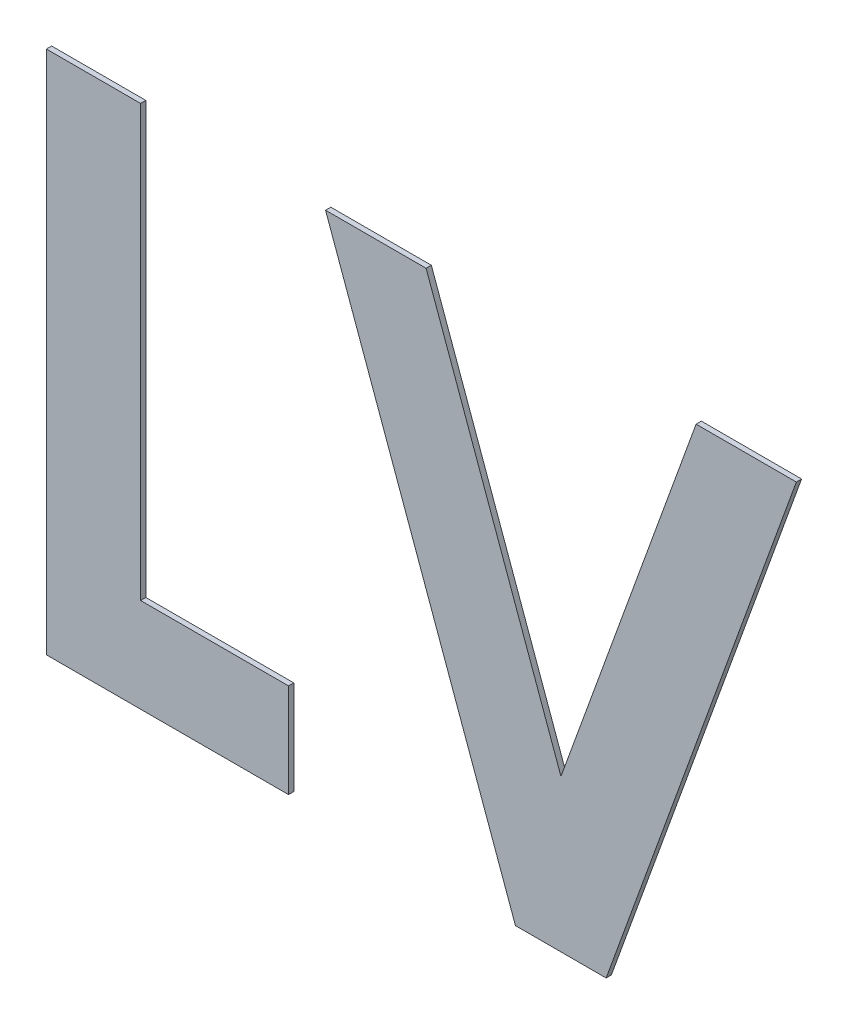
ISO-10303-21;
HEADER;
FILE_DESCRIPTION(('STEP AP214'),'2;1');
FILE_NAME('part.step','',(''),(''),'','','');
FILE_SCHEMA(('AUTOMOTIVE_DESIGN { 1 0 10303 214 1 1 1 1 }'));
ENDSEC;
DATA;
#1=APPLICATION_CONTEXT('core data for automotive mechanical design processes');
#2=APPLICATION_PROTOCOL_DEFINITION('international standard','automotive_design',2000,#1);
#3=PRODUCT_CONTEXT('',#1,'mechanical');
#4=PRODUCT('Part','Part','',(#3));
#5=PRODUCT_RELATED_PRODUCT_CATEGORY('part','',(#4));
#6=PRODUCT_DEFINITION_FORMATION('','',#4);
#7=PRODUCT_DEFINITION_CONTEXT('part definition',#1,'design');
#8=PRODUCT_DEFINITION('design','',#6,#7);
#9=PRODUCT_DEFINITION_SHAPE('','',#8);
#10=(LENGTH_UNIT() NAMED_UNIT(*) SI_UNIT(.MILLI.,.METRE.));
#11=(NAMED_UNIT(*) PLANE_ANGLE_UNIT() SI_UNIT($,.RADIAN.));
#12=(NAMED_UNIT(*) SI_UNIT($,.STERADIAN.) SOLID_ANGLE_UNIT());
#13=UNCERTAINTY_MEASURE_WITH_UNIT(LENGTH_MEASURE(1.E-05),#10,'distance_accuracy_value','');
#14=(GEOMETRIC_REPRESENTATION_CONTEXT(3) GLOBAL_UNCERTAINTY_ASSIGNED_CONTEXT((#13)) GLOBAL_UNIT_ASSIGNED_CONTEXT((#10,
#11,#12)) REPRESENTATION_CONTEXT('',''));
#15=CARTESIAN_POINT('',(0.,0.,0.));
#16=DIRECTION('',(0.,0.,1.));
#17=DIRECTION('',(1.,0.,0.));
#18=AXIS2_PLACEMENT_3D('',#15,#16,#17);
#19=CARTESIAN_POINT('',(1.8968858000619,0.686633141168239,0.1));
#20=DIRECTION('',(-0.940292875779529,-0.340366431597277,0.));
#21=DIRECTION('',(0.340366431597277,-0.940292875779529,0.));
#22=AXIS2_PLACEMENT_3D('',#19,#20,#21);
#23=PLANE('',#22);
#24=DIRECTION('',(-0.340366431597277,0.940292875779529,0.));
#25=VECTOR('',#24,1.);
#26=CARTESIAN_POINT('',(1.8968858000619,0.686633141168239,0.));
#27=LINE('',#26,#25);
#28=CARTESIAN_POINT('',(2.14543269230769,0.,0.));
#29=VERTEX_POINT('',#28);
#30=CARTESIAN_POINT('',(-1.47435897435898,10.,0.));
#31=VERTEX_POINT('',#30);
#32=EDGE_CURVE('E137',#29,#31,#27,.T.);
#33=ORIENTED_EDGE('',*,*,#32,.F.);
#34=DIRECTION('',(0.,0.,-1.));
#35=VECTOR('',#34,1.);
#36=CARTESIAN_POINT('',(2.14543269230769,0.,0.1));
#37=LINE('',#36,#35);
#38=CARTESIAN_POINT('',(2.14543269230769,0.,0.1));
#39=VERTEX_POINT('',#38);
#40=EDGE_CURVE('E12',#39,#29,#37,.T.);
#41=ORIENTED_EDGE('',*,*,#40,.F.);
#42=DIRECTION('',(-0.340366431597277,0.940292875779529,0.));
#43=VECTOR('',#42,1.);
#44=CARTESIAN_POINT('',(1.8968858000619,0.686633141168239,0.1));
#45=LINE('',#44,#43);
#46=CARTESIAN_POINT('',(-1.47435897435898,10.,0.1));
#47=VERTEX_POINT('',#46);
#48=EDGE_CURVE('E154',#39,#47,#45,.T.);
#49=ORIENTED_EDGE('',*,*,#48,.T.);
#50=DIRECTION('',(0.,0.,-1.));
#51=VECTOR('',#50,1.);
#52=CARTESIAN_POINT('',(-1.47435897435898,10.,0.1));
#53=LINE('',#52,#51);
#54=EDGE_CURVE('E65',#47,#31,#53,.T.);
#55=ORIENTED_EDGE('',*,*,#54,.T.);
#56=EDGE_LOOP('',(#33,#41,#49,#55));
#57=FACE_BOUND('',#56,.T.);
#58=ADVANCED_FACE('F49',(#57),#23,.T.);
#59=CARTESIAN_POINT('',(0.,0.,0.1));
#60=DIRECTION('',(0.,1.,0.));
#61=DIRECTION('',(0.,0.,1.));
#62=AXIS2_PLACEMENT_3D('',#59,#60,#61);
#63=PLANE('',#62);
#64=DIRECTION('',(1.,0.,0.));
#65=VECTOR('',#64,1.);
#66=CARTESIAN_POINT('',(0.,0.,0.));
#67=LINE('',#66,#65);
#68=CARTESIAN_POINT('',(3.87419871794872,0.,0.));
#69=VERTEX_POINT('',#68);
#70=EDGE_CURVE('E139',#29,#69,#67,.T.);
#71=ORIENTED_EDGE('',*,*,#70,.T.);
#72=DIRECTION('',(0.,0.,-1.));
#73=VECTOR('',#72,1.);
#74=CARTESIAN_POINT('',(3.87419871794872,0.,0.1));
#75=LINE('',#74,#73);
#76=CARTESIAN_POINT('',(3.87419871794872,0.,0.1));
#77=VERTEX_POINT('',#76);
#78=EDGE_CURVE('E57',#77,#69,#75,.T.);
#79=ORIENTED_EDGE('',*,*,#78,.F.);
#80=DIRECTION('',(1.,0.,0.));
#81=VECTOR('',#80,1.);
#82=CARTESIAN_POINT('',(0.,0.,0.1));
#83=LINE('',#82,#81);
#84=EDGE_CURVE('E173',#39,#77,#83,.T.);
#85=ORIENTED_EDGE('',*,*,#84,.F.);
#86=ORIENTED_EDGE('',*,*,#40,.T.);
#87=EDGE_LOOP('',(#71,#79,#85,#86));
#88=FACE_BOUND('',#87,.T.);
#89=ADVANCED_FACE('F167',(#88),#63,.F.);
#90=CARTESIAN_POINT('',(3.4240572582852,-1.24149511969075,0.1));
#91=DIRECTION('',(0.940111927409656,-0.340865903167363,0.));
#92=DIRECTION('',(0.340865903167363,0.940111927409656,0.));
#93=AXIS2_PLACEMENT_3D('',#90,#91,#92);
#94=PLANE('',#93);
#95=DIRECTION('',(-0.340865903167363,-0.940111927409656,0.));
#96=VECTOR('',#95,1.);
#97=CARTESIAN_POINT('',(3.4240572582852,-1.24149511969075,0.));
#98=LINE('',#97,#96);
#99=CARTESIAN_POINT('',(7.5,10.,0.));
#100=VERTEX_POINT('',#99);
#101=EDGE_CURVE('E142',#100,#69,#98,.T.);
#102=ORIENTED_EDGE('',*,*,#101,.F.);
#103=DIRECTION('',(0.,0.,-1.));
#104=VECTOR('',#103,1.);
#105=CARTESIAN_POINT('',(7.5,10.,0.1));
#106=LINE('',#105,#104);
#107=CARTESIAN_POINT('',(7.5,10.,0.1));
#108=VERTEX_POINT('',#107);
#109=EDGE_CURVE('E158',#108,#100,#106,.T.);
#110=ORIENTED_EDGE('',*,*,#109,.F.);
#111=DIRECTION('',(-0.340865903167363,-0.940111927409656,0.));
#112=VECTOR('',#111,1.);
#113=CARTESIAN_POINT('',(3.4240572582852,-1.24149511969075,0.1));
#114=LINE('',#113,#112);
#115=EDGE_CURVE('E164',#108,#77,#114,.T.);
#116=ORIENTED_EDGE('',*,*,#115,.T.);
#117=ORIENTED_EDGE('',*,*,#78,.T.);
#118=EDGE_LOOP('',(#102,#110,#116,#117));
#119=FACE_BOUND('',#118,.T.);
#120=ADVANCED_FACE('F163',(#119),#94,.T.);
#121=CARTESIAN_POINT('',(0.,10.,0.1));
#122=DIRECTION('',(0.,1.,0.));
#123=DIRECTION('',(0.,0.,1.));
#124=AXIS2_PLACEMENT_3D('',#121,#122,#123);
#125=PLANE('',#124);
#126=DIRECTION('',(1.,0.,0.));
#127=VECTOR('',#126,1.);
#128=CARTESIAN_POINT('',(0.,10.,0.));
#129=LINE('',#128,#127);
#130=CARTESIAN_POINT('',(5.58894230769231,10.,0.));
#131=VERTEX_POINT('',#130);
#132=EDGE_CURVE('E145',#131,#100,#129,.T.);
#133=ORIENTED_EDGE('',*,*,#132,.F.);
#134=DIRECTION('',(0.,0.,-1.));
#135=VECTOR('',#134,1.);
#136=CARTESIAN_POINT('',(5.58894230769231,10.,0.1));
#137=LINE('',#136,#135);
#138=CARTESIAN_POINT('',(5.58894230769231,10.,0.1));
#139=VERTEX_POINT('',#138);
#140=EDGE_CURVE('E118',#139,#131,#137,.T.);
#141=ORIENTED_EDGE('',*,*,#140,.F.);
#142=DIRECTION('',(1.,0.,0.));
#143=VECTOR('',#142,1.);
#144=CARTESIAN_POINT('',(0.,10.,0.1));
#145=LINE('',#144,#143);
#146=EDGE_CURVE('E129',#139,#108,#145,.T.);
#147=ORIENTED_EDGE('',*,*,#146,.T.);
#148=ORIENTED_EDGE('',*,*,#109,.T.);
#149=EDGE_LOOP('',(#133,#141,#147,#148));
#150=FACE_BOUND('',#149,.T.);
#151=ADVANCED_FACE('F172',(#150),#125,.T.);
#152=CARTESIAN_POINT('',(1.73422838813107,-0.628939003704614,0.1));
#153=DIRECTION('',(-0.940087214266092,0.340934054581555,0.));
#154=DIRECTION('',(-0.340934054581555,-0.940087214266092,0.));
#155=AXIS2_PLACEMENT_3D('',#152,#153,#154);
#156=PLANE('',#155);
#157=DIRECTION('',(0.340934054581555,0.940087214266092,0.));
#158=VECTOR('',#157,1.);
#159=CARTESIAN_POINT('',(1.73422838813107,-0.628939003704614,0.));
#160=LINE('',#159,#158);
#161=CARTESIAN_POINT('',(3.01282051282051,2.89663461538462,0.));
#162=VERTEX_POINT('',#161);
#163=EDGE_CURVE('E114',#162,#131,#160,.T.);
#164=ORIENTED_EDGE('',*,*,#163,.F.);
#165=DIRECTION('',(0.,0.,-1.));
#166=VECTOR('',#165,1.);
#167=CARTESIAN_POINT('',(3.01282051282051,2.89663461538462,0.1));
#168=LINE('',#167,#166);
#169=CARTESIAN_POINT('',(3.01282051282051,2.89663461538462,0.1));
#170=VERTEX_POINT('',#169);
#171=EDGE_CURVE('E109',#170,#162,#168,.T.);
#172=ORIENTED_EDGE('',*,*,#171,.F.);
#173=DIRECTION('',(0.340934054581555,0.940087214266092,0.));
#174=VECTOR('',#173,1.);
#175=CARTESIAN_POINT('',(1.73422838813107,-0.628939003704614,0.1));
#176=LINE('',#175,#174);
#177=EDGE_CURVE('E112',#170,#139,#176,.T.);
#178=ORIENTED_EDGE('',*,*,#177,.T.);
#179=ORIENTED_EDGE('',*,*,#140,.T.);
#180=EDGE_LOOP('',(#164,#172,#178,#179));
#181=FACE_BOUND('',#180,.T.);
#182=ADVANCED_FACE('F111',(#181),#156,.T.);
#183=CARTESIAN_POINT('',(3.59079534630478,1.29920767888016,0.1));
#184=DIRECTION('',(0.94034193178737,0.340230879436886,0.));
#185=DIRECTION('',(-0.340230879436886,0.94034193178737,0.));
#186=AXIS2_PLACEMENT_3D('',#183,#184,#185);
#187=PLANE('',#186);
#188=DIRECTION('',(0.340230879436886,-0.94034193178737,0.));
#189=VECTOR('',#188,1.);
#190=CARTESIAN_POINT('',(3.59079534630478,1.29920767888016,0.));
#191=LINE('',#190,#189);
#192=CARTESIAN_POINT('',(0.442708333333333,10.,0.));
#193=VERTEX_POINT('',#192);
#194=EDGE_CURVE('E149',#193,#162,#191,.T.);
#195=ORIENTED_EDGE('',*,*,#194,.F.);
#196=DIRECTION('',(0.,0.,-1.));
#197=VECTOR('',#196,1.);
#198=CARTESIAN_POINT('',(0.442708333333333,10.,0.1));
#199=LINE('',#198,#197);
#200=CARTESIAN_POINT('',(0.442708333333333,10.,0.1));
#201=VERTEX_POINT('',#200);
#202=EDGE_CURVE('E87',#201,#193,#199,.T.);
#203=ORIENTED_EDGE('',*,*,#202,.F.);
#204=DIRECTION('',(0.340230879436886,-0.94034193178737,0.));
#205=VECTOR('',#204,1.);
#206=CARTESIAN_POINT('',(3.59079534630478,1.29920767888016,0.1));
#207=LINE('',#206,#205);
#208=EDGE_CURVE('E126',#201,#170,#207,.T.);
#209=ORIENTED_EDGE('',*,*,#208,.T.);
#210=ORIENTED_EDGE('',*,*,#171,.T.);
#211=EDGE_LOOP('',(#195,#203,#209,#210));
#212=FACE_BOUND('',#211,.T.);
#213=ADVANCED_FACE('F131',(#212),#187,.T.);
#214=CARTESIAN_POINT('',(0.,10.,0.1));
#215=DIRECTION('',(0.,1.,0.));
#216=DIRECTION('',(0.,0.,1.));
#217=AXIS2_PLACEMENT_3D('',#214,#215,#216);
#218=PLANE('',#217);
#219=DIRECTION('',(1.,0.,0.));
#220=VECTOR('',#219,1.);
#221=CARTESIAN_POINT('',(0.,10.,0.));
#222=LINE('',#221,#220);
#223=EDGE_CURVE('E151',#31,#193,#222,.T.);
#224=ORIENTED_EDGE('',*,*,#223,.F.);
#225=ORIENTED_EDGE('',*,*,#54,.F.);
#226=DIRECTION('',(1.,0.,0.));
#227=VECTOR('',#226,1.);
#228=CARTESIAN_POINT('',(0.,10.,0.1));
#229=LINE('',#228,#227);
#230=EDGE_CURVE('E132',#47,#201,#229,.T.);
#231=ORIENTED_EDGE('',*,*,#230,.T.);
#232=ORIENTED_EDGE('',*,*,#202,.T.);
#233=EDGE_LOOP('',(#224,#225,#231,#232));
#234=FACE_BOUND('',#233,.T.);
#235=ADVANCED_FACE('F177',(#234),#218,.T.);
#236=CARTESIAN_POINT('',(0.,0.,0.1));
#237=DIRECTION('',(0.,0.,1.));
#238=DIRECTION('',(1.,0.,0.));
#239=AXIS2_PLACEMENT_3D('',#236,#237,#238);
#240=PLANE('',#239);
#241=ORIENTED_EDGE('',*,*,#48,.F.);
#242=ORIENTED_EDGE('',*,*,#84,.T.);
#243=ORIENTED_EDGE('',*,*,#115,.F.);
#244=ORIENTED_EDGE('',*,*,#146,.F.);
#245=ORIENTED_EDGE('',*,*,#177,.F.);
#246=ORIENTED_EDGE('',*,*,#208,.F.);
#247=ORIENTED_EDGE('',*,*,#230,.F.);
#248=EDGE_LOOP('',(#241,#242,#243,#244,#245,#246,#247));
#249=FACE_BOUND('',#248,.T.);
#250=ADVANCED_FACE('F124',(#249),#240,.T.);
#251=CARTESIAN_POINT('',(0.,0.,0.));
#252=DIRECTION('',(0.,0.,1.));
#253=DIRECTION('',(1.,0.,0.));
#254=AXIS2_PLACEMENT_3D('',#251,#252,#253);
#255=PLANE('',#254);
#256=ORIENTED_EDGE('',*,*,#32,.T.);
#257=ORIENTED_EDGE('',*,*,#223,.T.);
#258=ORIENTED_EDGE('',*,*,#194,.T.);
#259=ORIENTED_EDGE('',*,*,#163,.T.);
#260=ORIENTED_EDGE('',*,*,#132,.T.);
#261=ORIENTED_EDGE('',*,*,#101,.T.);
#262=ORIENTED_EDGE('',*,*,#70,.F.);
#263=EDGE_LOOP('',(#256,#257,#258,#259,#260,#261,#262));
#264=FACE_BOUND('',#263,.T.);
#265=ADVANCED_FACE('F169',(#264),#255,.F.);
#266=CLOSED_SHELL('',(#58,#89,#120,#151,#182,#213,#235,#250,#265));
#267=MANIFOLD_SOLID_BREP('B2',#266);
#268=CARTESIAN_POINT('',(-6.7948717948718,0.,0.1));
#269=DIRECTION('',(-1.,0.,0.));
#270=DIRECTION('',(0.,0.,1.));
#271=AXIS2_PLACEMENT_3D('',#268,#269,#270);
#272=PLANE('',#271);
#273=DIRECTION('',(0.,1.,0.));
#274=VECTOR('',#273,1.);
#275=CARTESIAN_POINT('',(-6.7948717948718,0.,0.));
#276=LINE('',#275,#274);
#277=CARTESIAN_POINT('',(-6.7948717948718,0.,0.));
#278=VERTEX_POINT('',#277);
#279=CARTESIAN_POINT('',(-6.7948717948718,10.,0.));
#280=VERTEX_POINT('',#279);
#281=EDGE_CURVE('E353',#278,#280,#276,.T.);
#282=ORIENTED_EDGE('',*,*,#281,.F.);
#283=DIRECTION('',(0.,0.,-1.));
#284=VECTOR('',#283,1.);
#285=CARTESIAN_POINT('',(-6.7948717948718,0.,0.1));
#286=LINE('',#285,#284);
#287=CARTESIAN_POINT('',(-6.7948717948718,0.,0.1));
#288=VERTEX_POINT('',#287);
#289=EDGE_CURVE('E47',#288,#278,#286,.T.);
#290=ORIENTED_EDGE('',*,*,#289,.F.);
#291=DIRECTION('',(0.,1.,0.));
#292=VECTOR('',#291,1.);
#293=CARTESIAN_POINT('',(-6.7948717948718,0.,0.1));
#294=LINE('',#293,#292);
#295=CARTESIAN_POINT('',(-6.7948717948718,10.,0.1));
#296=VERTEX_POINT('',#295);
#297=EDGE_CURVE('E367',#288,#296,#294,.T.);
#298=ORIENTED_EDGE('',*,*,#297,.T.);
#299=DIRECTION('',(0.,0.,-1.));
#300=VECTOR('',#299,1.);
#301=CARTESIAN_POINT('',(-6.7948717948718,10.,0.1));
#302=LINE('',#301,#300);
#303=EDGE_CURVE('E288',#296,#280,#302,.T.);
#304=ORIENTED_EDGE('',*,*,#303,.T.);
#305=EDGE_LOOP('',(#282,#290,#298,#304));
#306=FACE_BOUND('',#305,.T.);
#307=ADVANCED_FACE('F272',(#306),#272,.T.);
#308=CARTESIAN_POINT('',(0.,0.,0.1));
#309=DIRECTION('',(0.,1.,0.));
#310=DIRECTION('',(0.,0.,1.));
#311=AXIS2_PLACEMENT_3D('',#308,#309,#310);
#312=PLANE('',#311);
#313=DIRECTION('',(1.,0.,0.));
#314=VECTOR('',#313,1.);
#315=CARTESIAN_POINT('',(0.,0.,0.));
#316=LINE('',#315,#314);
#317=CARTESIAN_POINT('',(-2.17948717948718,0.,0.));
#318=VERTEX_POINT('',#317);
#319=EDGE_CURVE('E355',#278,#318,#316,.T.);
#320=ORIENTED_EDGE('',*,*,#319,.T.);
#321=DIRECTION('',(0.,0.,-1.));
#322=VECTOR('',#321,1.);
#323=CARTESIAN_POINT('',(-2.17948717948718,0.,0.1));
#324=LINE('',#323,#322);
#325=CARTESIAN_POINT('',(-2.17948717948718,0.,0.1));
#326=VERTEX_POINT('',#325);
#327=EDGE_CURVE('E280',#326,#318,#324,.T.);
#328=ORIENTED_EDGE('',*,*,#327,.F.);
#329=DIRECTION('',(1.,0.,0.));
#330=VECTOR('',#329,1.);
#331=CARTESIAN_POINT('',(0.,0.,0.1));
#332=LINE('',#331,#330);
#333=EDGE_CURVE('E461',#288,#326,#332,.T.);
#334=ORIENTED_EDGE('',*,*,#333,.F.);
#335=ORIENTED_EDGE('',*,*,#289,.T.);
#336=EDGE_LOOP('',(#320,#328,#334,#335));
#337=FACE_BOUND('',#336,.T.);
#338=ADVANCED_FACE('F376',(#337),#312,.F.);
#339=CARTESIAN_POINT('',(-2.17948717948718,0.,0.1));
#340=DIRECTION('',(1.,0.,0.));
#341=DIRECTION('',(0.,0.,-1.));
#342=AXIS2_PLACEMENT_3D('',#339,#340,#341);
#343=PLANE('',#342);
#344=DIRECTION('',(0.,-1.,0.));
#345=VECTOR('',#344,1.);
#346=CARTESIAN_POINT('',(-2.17948717948718,0.,0.));
#347=LINE('',#346,#345);
#348=CARTESIAN_POINT('',(-2.17948717948718,1.79487179487179,0.));
#349=VERTEX_POINT('',#348);
#350=EDGE_CURVE('E358',#349,#318,#347,.T.);
#351=ORIENTED_EDGE('',*,*,#350,.F.);
#352=DIRECTION('',(0.,0.,-1.));
#353=VECTOR('',#352,1.);
#354=CARTESIAN_POINT('',(-2.17948717948718,1.79487179487179,0.1));
#355=LINE('',#354,#353);
#356=CARTESIAN_POINT('',(-2.17948717948718,1.79487179487179,0.1));
#357=VERTEX_POINT('',#356);
#358=EDGE_CURVE('E335',#357,#349,#355,.T.);
#359=ORIENTED_EDGE('',*,*,#358,.F.);
#360=DIRECTION('',(0.,-1.,0.));
#361=VECTOR('',#360,1.);
#362=CARTESIAN_POINT('',(-2.17948717948718,0.,0.1));
#363=LINE('',#362,#361);
#364=EDGE_CURVE('E345',#357,#326,#363,.T.);
#365=ORIENTED_EDGE('',*,*,#364,.T.);
#366=ORIENTED_EDGE('',*,*,#327,.T.);
#367=EDGE_LOOP('',(#351,#359,#365,#366));
#368=FACE_BOUND('',#367,.T.);
#369=ADVANCED_FACE('F373',(#368),#343,.T.);
#370=CARTESIAN_POINT('',(0.,1.79487179487179,0.1));
#371=DIRECTION('',(0.,1.,0.));
#372=DIRECTION('',(0.,0.,1.));
#373=AXIS2_PLACEMENT_3D('',#370,#371,#372);
#374=PLANE('',#373);
#375=DIRECTION('',(1.,0.,0.));
#376=VECTOR('',#375,1.);
#377=CARTESIAN_POINT('',(0.,1.79487179487179,0.));
#378=LINE('',#377,#376);
#379=CARTESIAN_POINT('',(-5.,1.79487179487179,0.));
#380=VERTEX_POINT('',#379);
#381=EDGE_CURVE('E331',#380,#349,#378,.T.);
#382=ORIENTED_EDGE('',*,*,#381,.F.);
#383=DIRECTION('',(0.,0.,-1.));
#384=VECTOR('',#383,1.);
#385=CARTESIAN_POINT('',(-5.,1.79487179487179,0.1));
#386=LINE('',#385,#384);
#387=CARTESIAN_POINT('',(-5.,1.79487179487179,0.1));
#388=VERTEX_POINT('',#387);
#389=EDGE_CURVE('E326',#388,#380,#386,.T.);
#390=ORIENTED_EDGE('',*,*,#389,.F.);
#391=DIRECTION('',(1.,0.,0.));
#392=VECTOR('',#391,1.);
#393=CARTESIAN_POINT('',(0.,1.79487179487179,0.1));
#394=LINE('',#393,#392);
#395=EDGE_CURVE('E329',#388,#357,#394,.T.);
#396=ORIENTED_EDGE('',*,*,#395,.T.);
#397=ORIENTED_EDGE('',*,*,#358,.T.);
#398=EDGE_LOOP('',(#382,#390,#396,#397));
#399=FACE_BOUND('',#398,.T.);
#400=ADVANCED_FACE('F328',(#399),#374,.T.);
#401=CARTESIAN_POINT('',(-5.,0.,0.1));
#402=DIRECTION('',(1.,0.,0.));
#403=DIRECTION('',(0.,0.,-1.));
#404=AXIS2_PLACEMENT_3D('',#401,#402,#403);
#405=PLANE('',#404);
#406=DIRECTION('',(0.,-1.,0.));
#407=VECTOR('',#406,1.);
#408=CARTESIAN_POINT('',(-5.,0.,0.));
#409=LINE('',#408,#407);
#410=CARTESIAN_POINT('',(-5.,10.,0.));
#411=VERTEX_POINT('',#410);
#412=EDGE_CURVE('E362',#411,#380,#409,.T.);
#413=ORIENTED_EDGE('',*,*,#412,.F.);
#414=DIRECTION('',(0.,0.,-1.));
#415=VECTOR('',#414,1.);
#416=CARTESIAN_POINT('',(-5.,10.,0.1));
#417=LINE('',#416,#415);
#418=CARTESIAN_POINT('',(-5.,10.,0.1));
#419=VERTEX_POINT('',#418);
#420=EDGE_CURVE('E307',#419,#411,#417,.T.);
#421=ORIENTED_EDGE('',*,*,#420,.F.);
#422=DIRECTION('',(0.,-1.,0.));
#423=VECTOR('',#422,1.);
#424=CARTESIAN_POINT('',(-5.,0.,0.1));
#425=LINE('',#424,#423);
#426=EDGE_CURVE('E343',#419,#388,#425,.T.);
#427=ORIENTED_EDGE('',*,*,#426,.T.);
#428=ORIENTED_EDGE('',*,*,#389,.T.);
#429=EDGE_LOOP('',(#413,#421,#427,#428));
#430=FACE_BOUND('',#429,.T.);
#431=ADVANCED_FACE('F347',(#430),#405,.T.);
#432=CARTESIAN_POINT('',(0.,10.,0.1));
#433=DIRECTION('',(0.,1.,0.));
#434=DIRECTION('',(0.,0.,1.));
#435=AXIS2_PLACEMENT_3D('',#432,#433,#434);
#436=PLANE('',#435);
#437=DIRECTION('',(1.,0.,0.));
#438=VECTOR('',#437,1.);
#439=CARTESIAN_POINT('',(0.,10.,0.));
#440=LINE('',#439,#438);
#441=EDGE_CURVE('E364',#280,#411,#440,.T.);
#442=ORIENTED_EDGE('',*,*,#441,.F.);
#443=ORIENTED_EDGE('',*,*,#303,.F.);
#444=DIRECTION('',(1.,0.,0.));
#445=VECTOR('',#444,1.);
#446=CARTESIAN_POINT('',(0.,10.,0.1));
#447=LINE('',#446,#445);
#448=EDGE_CURVE('E348',#296,#419,#447,.T.);
#449=ORIENTED_EDGE('',*,*,#448,.T.);
#450=ORIENTED_EDGE('',*,*,#420,.T.);
#451=EDGE_LOOP('',(#442,#443,#449,#450));
#452=FACE_BOUND('',#451,.T.);
#453=ADVANCED_FACE('F379',(#452),#436,.T.);
#454=CARTESIAN_POINT('',(0.,0.,0.1));
#455=DIRECTION('',(0.,0.,1.));
#456=DIRECTION('',(1.,0.,0.));
#457=AXIS2_PLACEMENT_3D('',#454,#455,#456);
#458=PLANE('',#457);
#459=ORIENTED_EDGE('',*,*,#297,.F.);
#460=ORIENTED_EDGE('',*,*,#333,.T.);
#461=ORIENTED_EDGE('',*,*,#364,.F.);
#462=ORIENTED_EDGE('',*,*,#395,.F.);
#463=ORIENTED_EDGE('',*,*,#426,.F.);
#464=ORIENTED_EDGE('',*,*,#448,.F.);
#465=EDGE_LOOP('',(#459,#460,#461,#462,#463,#464));
#466=FACE_BOUND('',#465,.T.);
#467=ADVANCED_FACE('F341',(#466),#458,.T.);
#468=CARTESIAN_POINT('',(0.,0.,0.));
#469=DIRECTION('',(0.,0.,1.));
#470=DIRECTION('',(1.,0.,0.));
#471=AXIS2_PLACEMENT_3D('',#468,#469,#470);
#472=PLANE('',#471);
#473=ORIENTED_EDGE('',*,*,#281,.T.);
#474=ORIENTED_EDGE('',*,*,#441,.T.);
#475=ORIENTED_EDGE('',*,*,#412,.T.);
#476=ORIENTED_EDGE('',*,*,#381,.T.);
#477=ORIENTED_EDGE('',*,*,#350,.T.);
#478=ORIENTED_EDGE('',*,*,#319,.F.);
#479=EDGE_LOOP('',(#473,#474,#475,#476,#477,#478));
#480=FACE_BOUND('',#479,.T.);
#481=ADVANCED_FACE('F378',(#480),#472,.F.);
#482=CLOSED_SHELL('',(#307,#338,#369,#400,#431,#453,#467,#481));
#483=MANIFOLD_SOLID_BREP('B6',#482);
#484=ADVANCED_BREP_SHAPE_REPRESENTATION('',(#18,#267,#483),#14);
#485=SHAPE_DEFINITION_REPRESENTATION(#9,#484);
ENDSEC;
END-ISO-10303-21;
